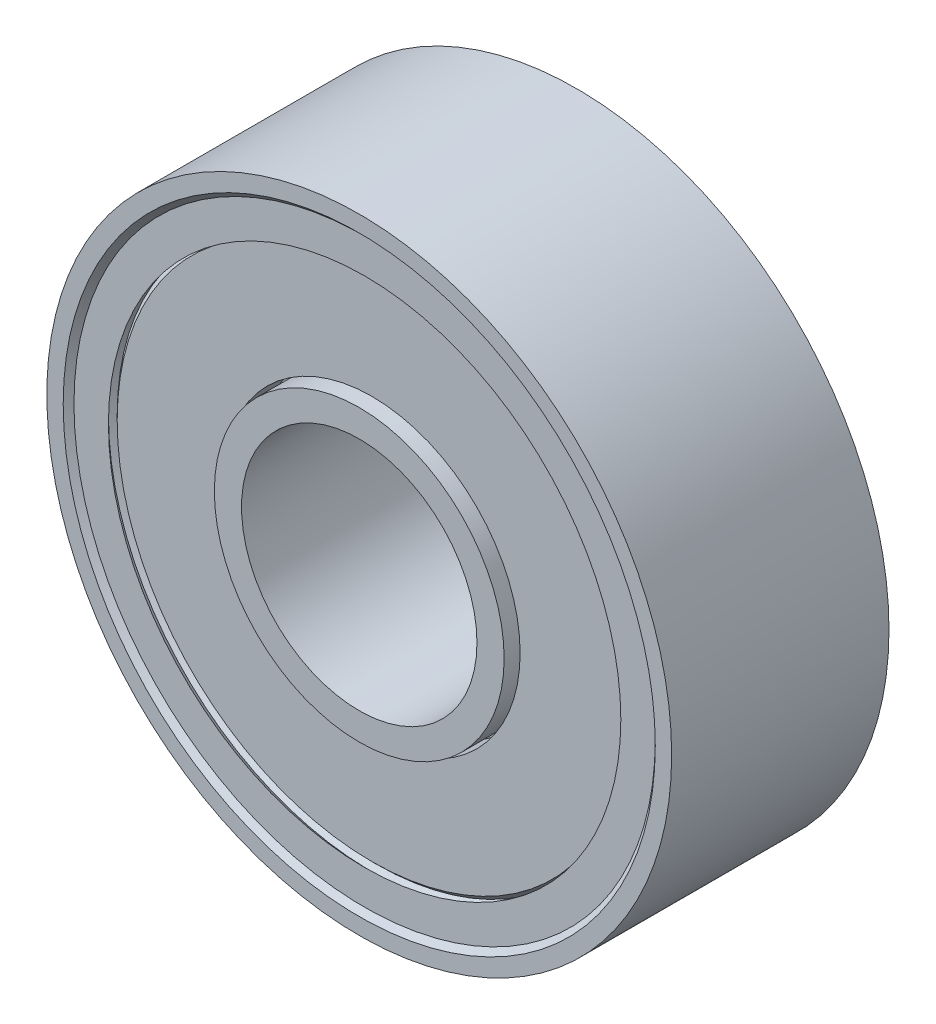
ISO-10303-21;
HEADER;
FILE_DESCRIPTION(('STEP AP214'),'2;1');
FILE_NAME('part.step','',(''),(''),'','','');
FILE_SCHEMA(('AUTOMOTIVE_DESIGN { 1 0 10303 214 1 1 1 1 }'));
ENDSEC;
DATA;
#1=APPLICATION_CONTEXT('core data for automotive mechanical design processes');
#2=APPLICATION_PROTOCOL_DEFINITION('international standard','automotive_design',2000,#1);
#3=PRODUCT_CONTEXT('',#1,'mechanical');
#4=PRODUCT('Part','Part','',(#3));
#5=PRODUCT_RELATED_PRODUCT_CATEGORY('part','',(#4));
#6=PRODUCT_DEFINITION_FORMATION('','',#4);
#7=PRODUCT_DEFINITION_CONTEXT('part definition',#1,'design');
#8=PRODUCT_DEFINITION('design','',#6,#7);
#9=PRODUCT_DEFINITION_SHAPE('','',#8);
#10=(LENGTH_UNIT() NAMED_UNIT(*) SI_UNIT(.MILLI.,.METRE.));
#11=(NAMED_UNIT(*) PLANE_ANGLE_UNIT() SI_UNIT($,.RADIAN.));
#12=(NAMED_UNIT(*) SI_UNIT($,.STERADIAN.) SOLID_ANGLE_UNIT());
#13=UNCERTAINTY_MEASURE_WITH_UNIT(LENGTH_MEASURE(1.E-05),#10,'distance_accuracy_value','');
#14=(GEOMETRIC_REPRESENTATION_CONTEXT(3) GLOBAL_UNCERTAINTY_ASSIGNED_CONTEXT((#13)) GLOBAL_UNIT_ASSIGNED_CONTEXT((#10,
#11,#12)) REPRESENTATION_CONTEXT('',''));
#15=CARTESIAN_POINT('',(0.,0.,0.));
#16=DIRECTION('',(0.,0.,1.));
#17=DIRECTION('',(1.,0.,0.));
#18=AXIS2_PLACEMENT_3D('',#15,#16,#17);
#19=CARTESIAN_POINT('',(0.,0.,0.));
#20=DIRECTION('',(0.,0.,1.));
#21=DIRECTION('',(1.,0.,0.));
#22=AXIS2_PLACEMENT_3D('',#19,#20,#21);
#23=PLANE('',#22);
#24=CARTESIAN_POINT('',(0.,0.,0.));
#25=DIRECTION('',(0.,0.,1.));
#26=DIRECTION('',(1.,0.,0.));
#27=AXIS2_PLACEMENT_3D('',#24,#25,#26);
#28=CIRCLE('',#27,6.9);
#29=CARTESIAN_POINT('',(6.9,0.,0.));
#30=VERTEX_POINT('',#29);
#31=EDGE_CURVE('E50',#30,#30,#28,.T.);
#32=ORIENTED_EDGE('',*,*,#31,.F.);
#33=EDGE_LOOP('',(#32));
#34=FACE_BOUND('',#33,.T.);
#35=CARTESIAN_POINT('',(0.,0.,0.));
#36=DIRECTION('',(0.,0.,1.));
#37=DIRECTION('',(1.,0.,0.));
#38=AXIS2_PLACEMENT_3D('',#35,#36,#37);
#39=CIRCLE('',#38,6.53831340219289);
#40=CARTESIAN_POINT('',(6.53831340219289,0.,0.));
#41=VERTEX_POINT('',#40);
#42=EDGE_CURVE('E66',#41,#41,#39,.T.);
#43=ORIENTED_EDGE('',*,*,#42,.T.);
#44=EDGE_LOOP('',(#43));
#45=FACE_BOUND('',#44,.T.);
#46=ADVANCED_FACE('F41',(#34,#45),#23,.F.);
#47=CARTESIAN_POINT('',(0.,0.,4.8));
#48=DIRECTION('',(0.,0.,1.));
#49=DIRECTION('',(1.,0.,0.));
#50=AXIS2_PLACEMENT_3D('',#47,#48,#49);
#51=PLANE('',#50);
#52=CARTESIAN_POINT('',(0.,0.,4.8));
#53=DIRECTION('',(0.,0.,1.));
#54=DIRECTION('',(1.,0.,0.));
#55=AXIS2_PLACEMENT_3D('',#52,#53,#54);
#56=CIRCLE('',#55,6.53831340219289);
#57=CARTESIAN_POINT('',(6.53831340219289,0.,4.8));
#58=VERTEX_POINT('',#57);
#59=EDGE_CURVE('E70',#58,#58,#56,.T.);
#60=ORIENTED_EDGE('',*,*,#59,.F.);
#61=EDGE_LOOP('',(#60));
#62=FACE_BOUND('',#61,.T.);
#63=CARTESIAN_POINT('',(0.,0.,4.8));
#64=DIRECTION('',(0.,0.,1.));
#65=DIRECTION('',(1.,0.,0.));
#66=AXIS2_PLACEMENT_3D('',#63,#64,#65);
#67=CIRCLE('',#66,6.9);
#68=CARTESIAN_POINT('',(6.9,0.,4.8));
#69=VERTEX_POINT('',#68);
#70=EDGE_CURVE('E10',#69,#69,#67,.T.);
#71=ORIENTED_EDGE('',*,*,#70,.T.);
#72=EDGE_LOOP('',(#71));
#73=FACE_BOUND('',#72,.T.);
#74=ADVANCED_FACE('F208',(#62,#73),#51,.T.);
#75=CARTESIAN_POINT('',(0.,0.,4.8));
#76=DIRECTION('',(0.,0.,-1.));
#77=DIRECTION('',(-1.,0.,0.));
#78=AXIS2_PLACEMENT_3D('',#75,#76,#77);
#79=CYLINDRICAL_SURFACE('',#78,6.9);
#80=ORIENTED_EDGE('',*,*,#70,.F.);
#81=EDGE_LOOP('',(#80));
#82=FACE_BOUND('',#81,.T.);
#83=ORIENTED_EDGE('',*,*,#31,.T.);
#84=EDGE_LOOP('',(#83));
#85=FACE_BOUND('',#84,.T.);
#86=ADVANCED_FACE('F43',(#82,#85),#79,.T.);
#87=CARTESIAN_POINT('',(0.,0.,-0.145775600047147));
#88=DIRECTION('',(0.,0.,-1.));
#89=DIRECTION('',(-1.,0.,0.));
#90=AXIS2_PLACEMENT_3D('',#87,#88,#89);
#91=CONICAL_SURFACE('',#90,6.68408900224003,0.785398163397443);
#92=CARTESIAN_POINT('',(0.,0.,0.118812800330591));
#93=DIRECTION('',(0.,0.,-1.));
#94=DIRECTION('',(-1.,0.,0.));
#95=AXIS2_PLACEMENT_3D('',#92,#93,#94);
#96=CIRCLE('',#95,6.4195006018623);
#97=CARTESIAN_POINT('',(-6.4195006018623,0.,0.118812800330591));
#98=VERTEX_POINT('',#97);
#99=EDGE_CURVE('E88',#98,#98,#96,.T.);
#100=ORIENTED_EDGE('',*,*,#99,.F.);
#101=EDGE_LOOP('',(#100));
#102=FACE_BOUND('',#101,.T.);
#103=ORIENTED_EDGE('',*,*,#42,.F.);
#104=EDGE_LOOP('',(#103));
#105=FACE_BOUND('',#104,.T.);
#106=ADVANCED_FACE('F231',(#102,#105),#91,.F.);
#107=CARTESIAN_POINT('',(0.,0.,4.87973216310469));
#108=DIRECTION('',(0.,0.,-1.));
#109=DIRECTION('',(-1.,0.,0.));
#110=AXIS2_PLACEMENT_3D('',#107,#108,#109);
#111=CYLINDRICAL_SURFACE('',#110,3.2);
#112=CARTESIAN_POINT('',(0.,0.,0.982569669609943));
#113=DIRECTION('',(0.,0.,-1.));
#114=DIRECTION('',(-1.,0.,0.));
#115=AXIS2_PLACEMENT_3D('',#112,#113,#114);
#116=CIRCLE('',#115,3.2);
#117=CARTESIAN_POINT('',(-3.2,0.,0.982569669609943));
#118=VERTEX_POINT('',#117);
#119=EDGE_CURVE('E117',#118,#118,#116,.T.);
#120=ORIENTED_EDGE('',*,*,#119,.T.);
#121=EDGE_LOOP('',(#120));
#122=FACE_BOUND('',#121,.T.);
#123=CARTESIAN_POINT('',(0.,0.,0.));
#124=DIRECTION('',(0.,0.,1.));
#125=DIRECTION('',(1.,0.,0.));
#126=AXIS2_PLACEMENT_3D('',#123,#124,#125);
#127=CIRCLE('',#126,3.2);
#128=CARTESIAN_POINT('',(3.2,0.,0.));
#129=VERTEX_POINT('',#128);
#130=EDGE_CURVE('E62',#129,#129,#127,.F.);
#131=ORIENTED_EDGE('',*,*,#130,.F.);
#132=EDGE_LOOP('',(#131));
#133=FACE_BOUND('',#132,.T.);
#134=ADVANCED_FACE('F228',(#122,#133),#111,.T.);
#135=CARTESIAN_POINT('',(0.,6.4195006018623,0.118812800330591));
#136=DIRECTION('',(0.,0.,1.));
#137=DIRECTION('',(1.,0.,0.));
#138=AXIS2_PLACEMENT_3D('',#135,#136,#137);
#139=PLANE('',#138);
#140=CARTESIAN_POINT('',(0.,0.,0.118812800330591));
#141=DIRECTION('',(0.,0.,-1.));
#142=DIRECTION('',(-1.,0.,0.));
#143=AXIS2_PLACEMENT_3D('',#140,#141,#142);
#144=CIRCLE('',#143,5.65838073730254);
#145=CARTESIAN_POINT('',(-5.65838073730254,0.,0.118812800330591));
#146=VERTEX_POINT('',#145);
#147=EDGE_CURVE('E93',#146,#146,#144,.T.);
#148=ORIENTED_EDGE('',*,*,#147,.F.);
#149=EDGE_LOOP('',(#148));
#150=FACE_BOUND('',#149,.T.);
#151=ORIENTED_EDGE('',*,*,#99,.T.);
#152=EDGE_LOOP('',(#151));
#153=FACE_BOUND('',#152,.T.);
#154=ADVANCED_FACE('F230',(#150,#153),#139,.F.);
#155=CARTESIAN_POINT('',(0.,0.,0.118812800330591));
#156=DIRECTION('',(0.,0.,1.));
#157=DIRECTION('',(1.,0.,0.));
#158=AXIS2_PLACEMENT_3D('',#155,#156,#157);
#159=CONICAL_SURFACE('',#158,5.65838073730254,0.785398163397454);
#160=CARTESIAN_POINT('',(0.,0.,0.280370153069765));
#161=DIRECTION('',(0.,0.,-1.));
#162=DIRECTION('',(-1.,0.,0.));
#163=AXIS2_PLACEMENT_3D('',#160,#161,#162);
#164=CIRCLE('',#163,5.81993809004171);
#165=CARTESIAN_POINT('',(-5.81993809004171,0.,0.280370153069765));
#166=VERTEX_POINT('',#165);
#167=EDGE_CURVE('E97',#166,#166,#164,.T.);
#168=ORIENTED_EDGE('',*,*,#167,.F.);
#169=EDGE_LOOP('',(#168));
#170=FACE_BOUND('',#169,.T.);
#171=ORIENTED_EDGE('',*,*,#147,.T.);
#172=EDGE_LOOP('',(#171));
#173=FACE_BOUND('',#172,.T.);
#174=ADVANCED_FACE('F237',(#170,#173),#159,.F.);
#175=CARTESIAN_POINT('',(0.,0.,0.280370153069765));
#176=DIRECTION('',(0.,0.,-1.));
#177=DIRECTION('',(-1.,0.,0.));
#178=AXIS2_PLACEMENT_3D('',#175,#176,#177);
#179=CONICAL_SURFACE('',#178,5.81993809004171,0.785398163397444);
#180=CARTESIAN_POINT('',(0.,0.,0.377078757405365));
#181=DIRECTION('',(0.,0.,-1.));
#182=DIRECTION('',(-1.,0.,0.));
#183=AXIS2_PLACEMENT_3D('',#180,#181,#182);
#184=CIRCLE('',#183,5.72322948570612);
#185=CARTESIAN_POINT('',(-5.72322948570612,0.,0.377078757405365));
#186=VERTEX_POINT('',#185);
#187=EDGE_CURVE('E101',#186,#186,#184,.T.);
#188=ORIENTED_EDGE('',*,*,#187,.F.);
#189=EDGE_LOOP('',(#188));
#190=FACE_BOUND('',#189,.T.);
#191=ORIENTED_EDGE('',*,*,#167,.T.);
#192=EDGE_LOOP('',(#191));
#193=FACE_BOUND('',#192,.T.);
#194=ADVANCED_FACE('F253',(#190,#193),#179,.F.);
#195=CARTESIAN_POINT('',(0.,0.,0.377078757405365));
#196=DIRECTION('',(0.,0.,1.));
#197=DIRECTION('',(1.,0.,0.));
#198=AXIS2_PLACEMENT_3D('',#195,#196,#197);
#199=CONICAL_SURFACE('',#198,5.72322948570612,0.785398163397453);
#200=CARTESIAN_POINT('',(0.,0.,0.280370153069765));
#201=DIRECTION('',(0.,0.,-1.));
#202=DIRECTION('',(-1.,0.,0.));
#203=AXIS2_PLACEMENT_3D('',#200,#201,#202);
#204=CIRCLE('',#203,5.62652088137051);
#205=CARTESIAN_POINT('',(-5.62652088137051,0.,0.280370153069765));
#206=VERTEX_POINT('',#205);
#207=EDGE_CURVE('E105',#206,#206,#204,.T.);
#208=ORIENTED_EDGE('',*,*,#207,.F.);
#209=EDGE_LOOP('',(#208));
#210=FACE_BOUND('',#209,.T.);
#211=ORIENTED_EDGE('',*,*,#187,.T.);
#212=EDGE_LOOP('',(#211));
#213=FACE_BOUND('',#212,.T.);
#214=ADVANCED_FACE('F249',(#210,#213),#199,.T.);
#215=CARTESIAN_POINT('',(0.,5.62652088137051,0.280370153069765));
#216=DIRECTION('',(0.,0.,1.));
#217=DIRECTION('',(1.,0.,0.));
#218=AXIS2_PLACEMENT_3D('',#215,#216,#217);
#219=PLANE('',#218);
#220=CARTESIAN_POINT('',(0.,0.,0.280370153069765));
#221=DIRECTION('',(0.,0.,-1.));
#222=DIRECTION('',(-1.,0.,0.));
#223=AXIS2_PLACEMENT_3D('',#220,#221,#222);
#224=CIRCLE('',#223,3.27293966677261);
#225=CARTESIAN_POINT('',(-3.27293966677261,0.,0.280370153069765));
#226=VERTEX_POINT('',#225);
#227=EDGE_CURVE('E109',#226,#226,#224,.T.);
#228=ORIENTED_EDGE('',*,*,#227,.F.);
#229=EDGE_LOOP('',(#228));
#230=FACE_BOUND('',#229,.T.);
#231=ORIENTED_EDGE('',*,*,#207,.T.);
#232=EDGE_LOOP('',(#231));
#233=FACE_BOUND('',#232,.T.);
#234=ADVANCED_FACE('F245',(#230,#233),#219,.F.);
#235=CARTESIAN_POINT('',(0.,0.,4.87973216310469));
#236=DIRECTION('',(0.,0.,-1.));
#237=DIRECTION('',(-1.,0.,0.));
#238=AXIS2_PLACEMENT_3D('',#235,#236,#237);
#239=CYLINDRICAL_SURFACE('',#238,3.27293966677261);
#240=CARTESIAN_POINT('',(0.,0.,0.982569669609943));
#241=DIRECTION('',(0.,0.,-1.));
#242=DIRECTION('',(-1.,0.,0.));
#243=AXIS2_PLACEMENT_3D('',#240,#241,#242);
#244=CIRCLE('',#243,3.27293966677261);
#245=CARTESIAN_POINT('',(-3.27293966677261,0.,0.982569669609943));
#246=VERTEX_POINT('',#245);
#247=EDGE_CURVE('E113',#246,#246,#244,.T.);
#248=ORIENTED_EDGE('',*,*,#247,.F.);
#249=EDGE_LOOP('',(#248));
#250=FACE_BOUND('',#249,.T.);
#251=ORIENTED_EDGE('',*,*,#227,.T.);
#252=EDGE_LOOP('',(#251));
#253=FACE_BOUND('',#252,.T.);
#254=ADVANCED_FACE('F203',(#250,#253),#239,.F.);
#255=CARTESIAN_POINT('',(0.,3.27293966677261,0.982569669609943));
#256=DIRECTION('',(0.,0.,1.));
#257=DIRECTION('',(1.,0.,0.));
#258=AXIS2_PLACEMENT_3D('',#255,#256,#257);
#259=PLANE('',#258);
#260=ORIENTED_EDGE('',*,*,#119,.F.);
#261=EDGE_LOOP('',(#260));
#262=FACE_BOUND('',#261,.T.);
#263=ORIENTED_EDGE('',*,*,#247,.T.);
#264=EDGE_LOOP('',(#263));
#265=FACE_BOUND('',#264,.T.);
#266=ADVANCED_FACE('F198',(#262,#265),#259,.F.);
#267=CARTESIAN_POINT('',(0.,0.,4.87973216310469));
#268=DIRECTION('',(0.,0.,-1.));
#269=DIRECTION('',(-1.,0.,0.));
#270=AXIS2_PLACEMENT_3D('',#267,#268,#269);
#271=CYLINDRICAL_SURFACE('',#270,3.2);
#272=CARTESIAN_POINT('',(0.,0.,4.8));
#273=DIRECTION('',(0.,0.,1.));
#274=DIRECTION('',(1.,0.,0.));
#275=AXIS2_PLACEMENT_3D('',#272,#273,#274);
#276=CIRCLE('',#275,3.2);
#277=CARTESIAN_POINT('',(3.2,0.,4.8));
#278=VERTEX_POINT('',#277);
#279=EDGE_CURVE('E45',#278,#278,#276,.F.);
#280=ORIENTED_EDGE('',*,*,#279,.T.);
#281=EDGE_LOOP('',(#280));
#282=FACE_BOUND('',#281,.T.);
#283=CARTESIAN_POINT('',(0.,0.,3.81743033039006));
#284=DIRECTION('',(0.,0.,-1.));
#285=DIRECTION('',(-1.,0.,0.));
#286=AXIS2_PLACEMENT_3D('',#283,#284,#285);
#287=CIRCLE('',#286,3.2);
#288=CARTESIAN_POINT('',(-3.2,0.,3.81743033039006));
#289=VERTEX_POINT('',#288);
#290=EDGE_CURVE('E67',#289,#289,#287,.T.);
#291=ORIENTED_EDGE('',*,*,#290,.F.);
#292=EDGE_LOOP('',(#291));
#293=FACE_BOUND('',#292,.T.);
#294=ADVANCED_FACE('F193',(#282,#293),#271,.T.);
#295=CARTESIAN_POINT('',(0.,3.27293966677261,3.81743033039006));
#296=DIRECTION('',(0.,0.,-1.));
#297=DIRECTION('',(-1.,0.,0.));
#298=AXIS2_PLACEMENT_3D('',#295,#296,#297);
#299=PLANE('',#298);
#300=CARTESIAN_POINT('',(0.,0.,3.81743033039006));
#301=DIRECTION('',(0.,0.,-1.));
#302=DIRECTION('',(-1.,0.,0.));
#303=AXIS2_PLACEMENT_3D('',#300,#301,#302);
#304=CIRCLE('',#303,3.27293966677261);
#305=CARTESIAN_POINT('',(-3.27293966677261,0.,3.81743033039006));
#306=VERTEX_POINT('',#305);
#307=EDGE_CURVE('E124',#306,#306,#304,.T.);
#308=ORIENTED_EDGE('',*,*,#307,.F.);
#309=EDGE_LOOP('',(#308));
#310=FACE_BOUND('',#309,.T.);
#311=ORIENTED_EDGE('',*,*,#290,.T.);
#312=EDGE_LOOP('',(#311));
#313=FACE_BOUND('',#312,.T.);
#314=ADVANCED_FACE('F187',(#310,#313),#299,.F.);
#315=CARTESIAN_POINT('',(0.,0.,4.87973216310469));
#316=DIRECTION('',(0.,0.,-1.));
#317=DIRECTION('',(-1.,0.,0.));
#318=AXIS2_PLACEMENT_3D('',#315,#316,#317);
#319=CYLINDRICAL_SURFACE('',#318,3.27293966677261);
#320=CARTESIAN_POINT('',(0.,0.,4.51962984693023));
#321=DIRECTION('',(0.,0.,-1.));
#322=DIRECTION('',(-1.,0.,0.));
#323=AXIS2_PLACEMENT_3D('',#320,#321,#322);
#324=CIRCLE('',#323,3.27293966677261);
#325=CARTESIAN_POINT('',(-3.27293966677261,0.,4.51962984693023));
#326=VERTEX_POINT('',#325);
#327=EDGE_CURVE('E128',#326,#326,#324,.T.);
#328=ORIENTED_EDGE('',*,*,#327,.F.);
#329=EDGE_LOOP('',(#328));
#330=FACE_BOUND('',#329,.T.);
#331=ORIENTED_EDGE('',*,*,#307,.T.);
#332=EDGE_LOOP('',(#331));
#333=FACE_BOUND('',#332,.T.);
#334=ADVANCED_FACE('F181',(#330,#333),#319,.F.);
#335=CARTESIAN_POINT('',(0.,5.62652088137051,4.51962984693023));
#336=DIRECTION('',(0.,0.,-1.));
#337=DIRECTION('',(-1.,0.,0.));
#338=AXIS2_PLACEMENT_3D('',#335,#336,#337);
#339=PLANE('',#338);
#340=CARTESIAN_POINT('',(0.,0.,4.51962984693023));
#341=DIRECTION('',(0.,0.,-1.));
#342=DIRECTION('',(-1.,0.,0.));
#343=AXIS2_PLACEMENT_3D('',#340,#341,#342);
#344=CIRCLE('',#343,5.62652088137051);
#345=CARTESIAN_POINT('',(-5.62652088137051,0.,4.51962984693023));
#346=VERTEX_POINT('',#345);
#347=EDGE_CURVE('E132',#346,#346,#344,.T.);
#348=ORIENTED_EDGE('',*,*,#347,.F.);
#349=EDGE_LOOP('',(#348));
#350=FACE_BOUND('',#349,.T.);
#351=ORIENTED_EDGE('',*,*,#327,.T.);
#352=EDGE_LOOP('',(#351));
#353=FACE_BOUND('',#352,.T.);
#354=ADVANCED_FACE('F175',(#350,#353),#339,.F.);
#355=CARTESIAN_POINT('',(0.,0.,4.51962984693023));
#356=DIRECTION('',(0.,0.,-1.));
#357=DIRECTION('',(-1.,0.,0.));
#358=AXIS2_PLACEMENT_3D('',#355,#356,#357);
#359=CONICAL_SURFACE('',#358,5.62652088137051,0.785398163397453);
#360=CARTESIAN_POINT('',(0.,0.,4.42292124259463));
#361=DIRECTION('',(0.,0.,-1.));
#362=DIRECTION('',(-1.,0.,0.));
#363=AXIS2_PLACEMENT_3D('',#360,#361,#362);
#364=CIRCLE('',#363,5.72322948570612);
#365=CARTESIAN_POINT('',(-5.72322948570612,0.,4.42292124259463));
#366=VERTEX_POINT('',#365);
#367=EDGE_CURVE('E136',#366,#366,#364,.T.);
#368=ORIENTED_EDGE('',*,*,#367,.F.);
#369=EDGE_LOOP('',(#368));
#370=FACE_BOUND('',#369,.T.);
#371=ORIENTED_EDGE('',*,*,#347,.T.);
#372=EDGE_LOOP('',(#371));
#373=FACE_BOUND('',#372,.T.);
#374=ADVANCED_FACE('F169',(#370,#373),#359,.T.);
#375=CARTESIAN_POINT('',(0.,0.,4.42292124259463));
#376=DIRECTION('',(0.,0.,1.));
#377=DIRECTION('',(1.,0.,0.));
#378=AXIS2_PLACEMENT_3D('',#375,#376,#377);
#379=CONICAL_SURFACE('',#378,5.72322948570612,0.785398163397444);
#380=CARTESIAN_POINT('',(0.,0.,4.51962984693023));
#381=DIRECTION('',(0.,0.,-1.));
#382=DIRECTION('',(-1.,0.,0.));
#383=AXIS2_PLACEMENT_3D('',#380,#381,#382);
#384=CIRCLE('',#383,5.81993809004171);
#385=CARTESIAN_POINT('',(-5.81993809004171,0.,4.51962984693023));
#386=VERTEX_POINT('',#385);
#387=EDGE_CURVE('E140',#386,#386,#384,.T.);
#388=ORIENTED_EDGE('',*,*,#387,.F.);
#389=EDGE_LOOP('',(#388));
#390=FACE_BOUND('',#389,.T.);
#391=ORIENTED_EDGE('',*,*,#367,.T.);
#392=EDGE_LOOP('',(#391));
#393=FACE_BOUND('',#392,.T.);
#394=ADVANCED_FACE('F163',(#390,#393),#379,.F.);
#395=CARTESIAN_POINT('',(0.,0.,4.51962984693023));
#396=DIRECTION('',(0.,0.,-1.));
#397=DIRECTION('',(-1.,0.,0.));
#398=AXIS2_PLACEMENT_3D('',#395,#396,#397);
#399=CONICAL_SURFACE('',#398,5.81993809004171,0.785398163397454);
#400=CARTESIAN_POINT('',(0.,0.,4.68118719966941));
#401=DIRECTION('',(0.,0.,-1.));
#402=DIRECTION('',(-1.,0.,0.));
#403=AXIS2_PLACEMENT_3D('',#400,#401,#402);
#404=CIRCLE('',#403,5.65838073730254);
#405=CARTESIAN_POINT('',(-5.65838073730254,0.,4.68118719966941));
#406=VERTEX_POINT('',#405);
#407=EDGE_CURVE('E144',#406,#406,#404,.T.);
#408=ORIENTED_EDGE('',*,*,#407,.F.);
#409=EDGE_LOOP('',(#408));
#410=FACE_BOUND('',#409,.T.);
#411=ORIENTED_EDGE('',*,*,#387,.T.);
#412=EDGE_LOOP('',(#411));
#413=FACE_BOUND('',#412,.T.);
#414=ADVANCED_FACE('F157',(#410,#413),#399,.F.);
#415=CARTESIAN_POINT('',(0.,6.4195006018623,4.68118719966941));
#416=DIRECTION('',(0.,0.,-1.));
#417=DIRECTION('',(-1.,0.,0.));
#418=AXIS2_PLACEMENT_3D('',#415,#416,#417);
#419=PLANE('',#418);
#420=CARTESIAN_POINT('',(0.,0.,4.68118719966941));
#421=DIRECTION('',(0.,0.,-1.));
#422=DIRECTION('',(-1.,0.,0.));
#423=AXIS2_PLACEMENT_3D('',#420,#421,#422);
#424=CIRCLE('',#423,6.4195006018623);
#425=CARTESIAN_POINT('',(-6.4195006018623,0.,4.68118719966941));
#426=VERTEX_POINT('',#425);
#427=EDGE_CURVE('E92',#426,#426,#424,.T.);
#428=ORIENTED_EDGE('',*,*,#427,.F.);
#429=EDGE_LOOP('',(#428));
#430=FACE_BOUND('',#429,.T.);
#431=ORIENTED_EDGE('',*,*,#407,.T.);
#432=EDGE_LOOP('',(#431));
#433=FACE_BOUND('',#432,.T.);
#434=ADVANCED_FACE('F154',(#430,#433),#419,.F.);
#435=CARTESIAN_POINT('',(0.,0.,4.68118719966941));
#436=DIRECTION('',(0.,0.,1.));
#437=DIRECTION('',(1.,0.,0.));
#438=AXIS2_PLACEMENT_3D('',#435,#436,#437);
#439=CONICAL_SURFACE('',#438,6.4195006018623,0.785398163397443);
#440=ORIENTED_EDGE('',*,*,#59,.T.);
#441=EDGE_LOOP('',(#440));
#442=FACE_BOUND('',#441,.T.);
#443=ORIENTED_EDGE('',*,*,#427,.T.);
#444=EDGE_LOOP('',(#443));
#445=FACE_BOUND('',#444,.T.);
#446=ADVANCED_FACE('F152',(#442,#445),#439,.F.);
#447=ORIENTED_EDGE('',*,*,#279,.F.);
#448=EDGE_LOOP('',(#447));
#449=FACE_BOUND('',#448,.T.);
#450=CARTESIAN_POINT('',(0.,0.,4.8));
#451=DIRECTION('',(0.,0.,1.));
#452=DIRECTION('',(1.,0.,0.));
#453=AXIS2_PLACEMENT_3D('',#450,#451,#452);
#454=CIRCLE('',#453,2.6);
#455=CARTESIAN_POINT('',(2.6,0.,4.8));
#456=VERTEX_POINT('',#455);
#457=EDGE_CURVE('E56',#456,#456,#454,.T.);
#458=ORIENTED_EDGE('',*,*,#457,.F.);
#459=EDGE_LOOP('',(#458));
#460=FACE_BOUND('',#459,.T.);
#461=ADVANCED_FACE('F216',(#449,#460),#51,.T.);
#462=CARTESIAN_POINT('',(0.,0.,4.8));
#463=DIRECTION('',(0.,0.,-1.));
#464=DIRECTION('',(-1.,0.,0.));
#465=AXIS2_PLACEMENT_3D('',#462,#463,#464);
#466=CYLINDRICAL_SURFACE('',#465,2.6);
#467=ORIENTED_EDGE('',*,*,#457,.T.);
#468=EDGE_LOOP('',(#467));
#469=FACE_BOUND('',#468,.T.);
#470=CARTESIAN_POINT('',(0.,0.,0.));
#471=DIRECTION('',(0.,0.,1.));
#472=DIRECTION('',(1.,0.,0.));
#473=AXIS2_PLACEMENT_3D('',#470,#471,#472);
#474=CIRCLE('',#473,2.6);
#475=CARTESIAN_POINT('',(2.6,0.,0.));
#476=VERTEX_POINT('',#475);
#477=EDGE_CURVE('E59',#476,#476,#474,.T.);
#478=ORIENTED_EDGE('',*,*,#477,.F.);
#479=EDGE_LOOP('',(#478));
#480=FACE_BOUND('',#479,.T.);
#481=ADVANCED_FACE('F220',(#469,#480),#466,.F.);
#482=ORIENTED_EDGE('',*,*,#477,.T.);
#483=EDGE_LOOP('',(#482));
#484=FACE_BOUND('',#483,.T.);
#485=ORIENTED_EDGE('',*,*,#130,.T.);
#486=EDGE_LOOP('',(#485));
#487=FACE_BOUND('',#486,.T.);
#488=ADVANCED_FACE('F210',(#484,#487),#23,.F.);
#489=CLOSED_SHELL('',(#46,#74,#86,#106,#134,#154,#174,#194,#214,#234,#254,#266,#294,#314,#334,
#354,#374,#394,#414,#434,#446,#461,#481,#488));
#490=MANIFOLD_SOLID_BREP('B2',#489);
#491=ADVANCED_BREP_SHAPE_REPRESENTATION('',(#18,#490),#14);
#492=SHAPE_DEFINITION_REPRESENTATION(#9,#491);
ENDSEC;
END-ISO-10303-21;
